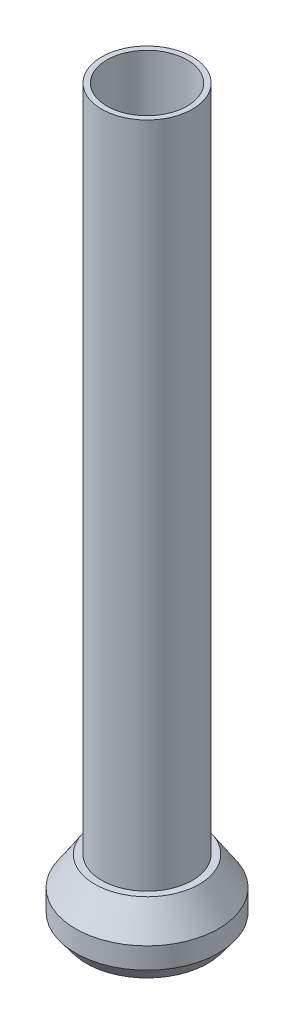
ISO-10303-21;
HEADER;
FILE_DESCRIPTION(('STEP AP214'),'2;1');
FILE_NAME('part.step','',(''),(''),'','','');
FILE_SCHEMA(('AUTOMOTIVE_DESIGN { 1 0 10303 214 1 1 1 1 }'));
ENDSEC;
DATA;
#1=APPLICATION_CONTEXT('core data for automotive mechanical design processes');
#2=APPLICATION_PROTOCOL_DEFINITION('international standard','automotive_design',2000,#1);
#3=PRODUCT_CONTEXT('',#1,'mechanical');
#4=PRODUCT('Part','Part','',(#3));
#5=PRODUCT_RELATED_PRODUCT_CATEGORY('part','',(#4));
#6=PRODUCT_DEFINITION_FORMATION('','',#4);
#7=PRODUCT_DEFINITION_CONTEXT('part definition',#1,'design');
#8=PRODUCT_DEFINITION('design','',#6,#7);
#9=PRODUCT_DEFINITION_SHAPE('','',#8);
#10=(LENGTH_UNIT() NAMED_UNIT(*) SI_UNIT(.MILLI.,.METRE.));
#11=(NAMED_UNIT(*) PLANE_ANGLE_UNIT() SI_UNIT($,.RADIAN.));
#12=(NAMED_UNIT(*) SI_UNIT($,.STERADIAN.) SOLID_ANGLE_UNIT());
#13=UNCERTAINTY_MEASURE_WITH_UNIT(LENGTH_MEASURE(1.E-05),#10,'distance_accuracy_value','');
#14=(GEOMETRIC_REPRESENTATION_CONTEXT(3) GLOBAL_UNCERTAINTY_ASSIGNED_CONTEXT((#13)) GLOBAL_UNIT_ASSIGNED_CONTEXT((#10,
#11,#12)) REPRESENTATION_CONTEXT('',''));
#15=CARTESIAN_POINT('',(0.,0.,0.));
#16=DIRECTION('',(0.,0.,1.));
#17=DIRECTION('',(1.,0.,0.));
#18=AXIS2_PLACEMENT_3D('',#15,#16,#17);
#19=CARTESIAN_POINT('',(0.,205.,0.));
#20=DIRECTION('',(0.,1.,0.));
#21=DIRECTION('',(0.,0.,1.));
#22=AXIS2_PLACEMENT_3D('',#19,#20,#21);
#23=PLANE('',#22);
#24=CARTESIAN_POINT('',(0.,205.,0.));
#25=DIRECTION('',(0.,1.,0.));
#26=DIRECTION('',(0.,0.,1.));
#27=AXIS2_PLACEMENT_3D('',#24,#25,#26);
#28=CIRCLE('',#27,12.7);
#29=CARTESIAN_POINT('',(0.,205.,-12.7));
#30=VERTEX_POINT('',#29);
#31=EDGE_CURVE('E44',#30,#30,#28,.T.);
#32=ORIENTED_EDGE('',*,*,#31,.T.);
#33=EDGE_LOOP('',(#32));
#34=FACE_BOUND('',#33,.T.);
#35=CARTESIAN_POINT('',(0.,205.,0.));
#36=DIRECTION('',(0.,1.,0.));
#37=DIRECTION('',(0.,0.,1.));
#38=AXIS2_PLACEMENT_3D('',#35,#36,#37);
#39=CIRCLE('',#38,11.227);
#40=CARTESIAN_POINT('',(0.,205.,-11.227));
#41=VERTEX_POINT('',#40);
#42=EDGE_CURVE('E48',#41,#41,#39,.T.);
#43=ORIENTED_EDGE('',*,*,#42,.F.);
#44=EDGE_LOOP('',(#43));
#45=FACE_BOUND('',#44,.T.);
#46=ADVANCED_FACE('F37',(#34,#45),#23,.T.);
#47=CARTESIAN_POINT('',(0.,205.,0.));
#48=DIRECTION('',(0.,-1.,0.));
#49=DIRECTION('',(0.,0.,-1.));
#50=AXIS2_PLACEMENT_3D('',#47,#48,#49);
#51=CYLINDRICAL_SURFACE('',#50,12.7);
#52=CARTESIAN_POINT('',(0.,18.,0.));
#53=DIRECTION('',(0.,1.,0.));
#54=DIRECTION('',(0.,0.,1.));
#55=AXIS2_PLACEMENT_3D('',#52,#53,#54);
#56=CIRCLE('',#55,12.7);
#57=CARTESIAN_POINT('',(0.,18.,-12.7));
#58=VERTEX_POINT('',#57);
#59=EDGE_CURVE('E52',#58,#58,#56,.T.);
#60=CARTESIAN_POINT('',(0.,18.,-12.7));
#61=CARTESIAN_POINT('',(0.,19.9479166666666,-12.7));
#62=CARTESIAN_POINT('',(0.,21.8958333333333,-12.7));
#63=CARTESIAN_POINT('',(0.,25.7916666666666,-12.7));
#64=CARTESIAN_POINT('',(0.,27.7395833333333,-12.7));
#65=CARTESIAN_POINT('',(0.,31.6354166666666,-12.7));
#66=CARTESIAN_POINT('',(0.,33.5833333333333,-12.7));
#67=CARTESIAN_POINT('',(0.,37.4791666666666,-12.7));
#68=CARTESIAN_POINT('',(0.,39.4270833333333,-12.7));
#69=CARTESIAN_POINT('',(0.,43.3229166666666,-12.7));
#70=CARTESIAN_POINT('',(0.,45.2708333333333,-12.7));
#71=CARTESIAN_POINT('',(0.,49.1666666666666,-12.7));
#72=CARTESIAN_POINT('',(0.,51.1145833333333,-12.7));
#73=CARTESIAN_POINT('',(0.,55.0104166666666,-12.7));
#74=CARTESIAN_POINT('',(0.,56.9583333333333,-12.7));
#75=CARTESIAN_POINT('',(0.,60.8541666666666,-12.7));
#76=CARTESIAN_POINT('',(0.,62.8020833333333,-12.7));
#77=CARTESIAN_POINT('',(0.,66.6979166666666,-12.7));
#78=CARTESIAN_POINT('',(0.,68.6458333333333,-12.7));
#79=CARTESIAN_POINT('',(0.,72.5416666666666,-12.7));
#80=CARTESIAN_POINT('',(0.,74.4895833333333,-12.7));
#81=CARTESIAN_POINT('',(0.,78.3854166666666,-12.7));
#82=CARTESIAN_POINT('',(0.,80.3333333333333,-12.7));
#83=CARTESIAN_POINT('',(0.,84.2291666666666,-12.7));
#84=CARTESIAN_POINT('',(0.,86.1770833333333,-12.7));
#85=CARTESIAN_POINT('',(0.,90.0729166666666,-12.7));
#86=CARTESIAN_POINT('',(0.,92.0208333333333,-12.7));
#87=CARTESIAN_POINT('',(0.,95.9166666666666,-12.7));
#88=CARTESIAN_POINT('',(0.,97.8645833333333,-12.7));
#89=CARTESIAN_POINT('',(0.,101.760416666667,-12.7));
#90=CARTESIAN_POINT('',(0.,103.708333333333,-12.7));
#91=CARTESIAN_POINT('',(0.,107.604166666667,-12.7));
#92=CARTESIAN_POINT('',(0.,109.552083333333,-12.7));
#93=CARTESIAN_POINT('',(0.,113.447916666667,-12.7));
#94=CARTESIAN_POINT('',(0.,115.395833333333,-12.7));
#95=CARTESIAN_POINT('',(0.,119.291666666667,-12.7));
#96=CARTESIAN_POINT('',(0.,121.239583333333,-12.7));
#97=CARTESIAN_POINT('',(0.,125.135416666667,-12.7));
#98=CARTESIAN_POINT('',(0.,127.083333333333,-12.7));
#99=CARTESIAN_POINT('',(0.,130.979166666667,-12.7));
#100=CARTESIAN_POINT('',(0.,132.927083333333,-12.7));
#101=CARTESIAN_POINT('',(0.,136.822916666667,-12.7));
#102=CARTESIAN_POINT('',(0.,138.770833333333,-12.7));
#103=CARTESIAN_POINT('',(0.,142.666666666667,-12.7));
#104=CARTESIAN_POINT('',(0.,144.614583333333,-12.7));
#105=CARTESIAN_POINT('',(0.,148.510416666667,-12.7));
#106=CARTESIAN_POINT('',(0.,150.458333333333,-12.7));
#107=CARTESIAN_POINT('',(0.,154.354166666667,-12.7));
#108=CARTESIAN_POINT('',(0.,156.302083333333,-12.7));
#109=CARTESIAN_POINT('',(0.,160.197916666667,-12.7));
#110=CARTESIAN_POINT('',(0.,162.145833333333,-12.7));
#111=CARTESIAN_POINT('',(0.,166.041666666667,-12.7));
#112=CARTESIAN_POINT('',(0.,167.989583333333,-12.7));
#113=CARTESIAN_POINT('',(0.,171.885416666667,-12.7));
#114=CARTESIAN_POINT('',(0.,173.833333333333,-12.7));
#115=CARTESIAN_POINT('',(0.,177.729166666667,-12.7));
#116=CARTESIAN_POINT('',(0.,179.677083333333,-12.7));
#117=CARTESIAN_POINT('',(0.,183.572916666667,-12.7));
#118=CARTESIAN_POINT('',(0.,185.520833333333,-12.7));
#119=CARTESIAN_POINT('',(0.,189.416666666667,-12.7));
#120=CARTESIAN_POINT('',(0.,191.364583333333,-12.7));
#121=CARTESIAN_POINT('',(0.,195.260416666667,-12.7));
#122=CARTESIAN_POINT('',(0.,197.208333333333,-12.7));
#123=CARTESIAN_POINT('',(0.,201.104166666667,-12.7));
#124=CARTESIAN_POINT('',(0.,203.052083333333,-12.7));
#125=CARTESIAN_POINT('',(0.,205.,-12.7));
#126=B_SPLINE_CURVE_WITH_KNOTS('',3,(#60,#61,#62,#63,#64,#65,#66,#67,#68,#69,#70,#71,#72,#73,
#74,#75,#76,#77,#78,#79,#80,#81,#82,#83,#84,#85,#86,#87,#88,#89,#90,#91,#92,#93,#94,#95,#96,#97,
#98,#99,#100,#101,#102,#103,#104,#105,#106,#107,#108,#109,#110,#111,#112,#113,#114,#115,#116,
#117,#118,#119,#120,#121,#122,#123,#124,#125),.UNSPECIFIED.,.F.,.F.,(4,2,2,2,2,2,2,2,2,2,2,2,2,
2,2,2,2,2,2,2,2,2,2,2,2,2,2,2,2,2,2,2,4),(0.,5.84375000000001,11.6875,17.53125,23.375,29.21875,
35.0625,40.90625,46.75,52.59375,58.4375,64.28125,70.125,75.96875,81.8125,87.65625,93.5,99.34375,
105.1875,111.03125,116.875,122.71875,128.5625,134.40625,140.25,146.09375,151.9375,157.78125,
163.625,169.46875,175.3125,181.15625,187.),.UNSPECIFIED.);
#127=EDGE_CURVE('BSEAM39',#58,#30,#126,.T.);
#128=ORIENTED_EDGE('',*,*,#59,.T.);
#129=ORIENTED_EDGE('',*,*,#31,.F.);
#130=ORIENTED_EDGE('',*,*,#127,.T.);
#131=ORIENTED_EDGE('',*,*,#127,.F.);
#132=EDGE_LOOP('',(#128,#130,#129,#131));
#133=FACE_BOUND('',#132,.T.);
#134=ADVANCED_FACE('F39',(#133),#51,.T.);
#135=CARTESIAN_POINT('',(0.,205.,0.));
#136=DIRECTION('',(0.,-1.,0.));
#137=DIRECTION('',(0.,0.,-1.));
#138=AXIS2_PLACEMENT_3D('',#135,#136,#137);
#139=CYLINDRICAL_SURFACE('',#138,11.227);
#140=CARTESIAN_POINT('',(0.,18.,0.));
#141=DIRECTION('',(0.,1.,0.));
#142=DIRECTION('',(0.,0.,1.));
#143=AXIS2_PLACEMENT_3D('',#140,#141,#142);
#144=CIRCLE('',#143,11.227);
#145=CARTESIAN_POINT('',(0.,18.,-11.227));
#146=VERTEX_POINT('',#145);
#147=EDGE_CURVE('E10',#146,#146,#144,.T.);
#148=CARTESIAN_POINT('',(0.,18.,-11.227));
#149=CARTESIAN_POINT('',(0.,19.9479166666666,-11.227));
#150=CARTESIAN_POINT('',(0.,21.8958333333333,-11.227));
#151=CARTESIAN_POINT('',(0.,25.7916666666666,-11.227));
#152=CARTESIAN_POINT('',(0.,27.7395833333333,-11.227));
#153=CARTESIAN_POINT('',(0.,31.6354166666666,-11.227));
#154=CARTESIAN_POINT('',(0.,33.5833333333333,-11.227));
#155=CARTESIAN_POINT('',(0.,37.4791666666666,-11.227));
#156=CARTESIAN_POINT('',(0.,39.4270833333333,-11.227));
#157=CARTESIAN_POINT('',(0.,43.3229166666666,-11.227));
#158=CARTESIAN_POINT('',(0.,45.2708333333333,-11.227));
#159=CARTESIAN_POINT('',(0.,49.1666666666666,-11.227));
#160=CARTESIAN_POINT('',(0.,51.1145833333333,-11.227));
#161=CARTESIAN_POINT('',(0.,55.0104166666666,-11.227));
#162=CARTESIAN_POINT('',(0.,56.9583333333333,-11.227));
#163=CARTESIAN_POINT('',(0.,60.8541666666666,-11.227));
#164=CARTESIAN_POINT('',(0.,62.8020833333333,-11.227));
#165=CARTESIAN_POINT('',(0.,66.6979166666666,-11.227));
#166=CARTESIAN_POINT('',(0.,68.6458333333333,-11.227));
#167=CARTESIAN_POINT('',(0.,72.5416666666667,-11.227));
#168=CARTESIAN_POINT('',(0.,74.4895833333333,-11.227));
#169=CARTESIAN_POINT('',(0.,78.3854166666667,-11.227));
#170=CARTESIAN_POINT('',(0.,80.3333333333333,-11.227));
#171=CARTESIAN_POINT('',(0.,84.2291666666666,-11.227));
#172=CARTESIAN_POINT('',(0.,86.1770833333333,-11.227));
#173=CARTESIAN_POINT('',(0.,90.0729166666666,-11.227));
#174=CARTESIAN_POINT('',(0.,92.0208333333333,-11.227));
#175=CARTESIAN_POINT('',(0.,95.9166666666666,-11.227));
#176=CARTESIAN_POINT('',(0.,97.8645833333333,-11.227));
#177=CARTESIAN_POINT('',(0.,101.760416666667,-11.227));
#178=CARTESIAN_POINT('',(0.,103.708333333333,-11.227));
#179=CARTESIAN_POINT('',(0.,107.604166666667,-11.227));
#180=CARTESIAN_POINT('',(0.,109.552083333333,-11.227));
#181=CARTESIAN_POINT('',(0.,113.447916666667,-11.227));
#182=CARTESIAN_POINT('',(0.,115.395833333333,-11.227));
#183=CARTESIAN_POINT('',(0.,119.291666666667,-11.227));
#184=CARTESIAN_POINT('',(0.,121.239583333333,-11.227));
#185=CARTESIAN_POINT('',(0.,125.135416666667,-11.227));
#186=CARTESIAN_POINT('',(0.,127.083333333333,-11.227));
#187=CARTESIAN_POINT('',(0.,130.979166666667,-11.227));
#188=CARTESIAN_POINT('',(0.,132.927083333333,-11.227));
#189=CARTESIAN_POINT('',(0.,136.822916666667,-11.227));
#190=CARTESIAN_POINT('',(0.,138.770833333333,-11.227));
#191=CARTESIAN_POINT('',(0.,142.666666666667,-11.227));
#192=CARTESIAN_POINT('',(0.,144.614583333333,-11.227));
#193=CARTESIAN_POINT('',(0.,148.510416666667,-11.227));
#194=CARTESIAN_POINT('',(0.,150.458333333333,-11.227));
#195=CARTESIAN_POINT('',(0.,154.354166666667,-11.227));
#196=CARTESIAN_POINT('',(0.,156.302083333333,-11.227));
#197=CARTESIAN_POINT('',(0.,160.197916666667,-11.227));
#198=CARTESIAN_POINT('',(0.,162.145833333333,-11.227));
#199=CARTESIAN_POINT('',(0.,166.041666666667,-11.227));
#200=CARTESIAN_POINT('',(0.,167.989583333333,-11.227));
#201=CARTESIAN_POINT('',(0.,171.885416666667,-11.227));
#202=CARTESIAN_POINT('',(0.,173.833333333333,-11.227));
#203=CARTESIAN_POINT('',(0.,177.729166666667,-11.227));
#204=CARTESIAN_POINT('',(0.,179.677083333333,-11.227));
#205=CARTESIAN_POINT('',(0.,183.572916666667,-11.227));
#206=CARTESIAN_POINT('',(0.,185.520833333333,-11.227));
#207=CARTESIAN_POINT('',(0.,189.416666666667,-11.227));
#208=CARTESIAN_POINT('',(0.,191.364583333333,-11.227));
#209=CARTESIAN_POINT('',(0.,195.260416666667,-11.227));
#210=CARTESIAN_POINT('',(0.,197.208333333333,-11.227));
#211=CARTESIAN_POINT('',(0.,201.104166666667,-11.227));
#212=CARTESIAN_POINT('',(0.,203.052083333333,-11.227));
#213=CARTESIAN_POINT('',(0.,205.,-11.227));
#214=B_SPLINE_CURVE_WITH_KNOTS('',3,(#148,#149,#150,#151,#152,#153,#154,#155,#156,#157,#158,
#159,#160,#161,#162,#163,#164,#165,#166,#167,#168,#169,#170,#171,#172,#173,#174,#175,#176,#177,
#178,#179,#180,#181,#182,#183,#184,#185,#186,#187,#188,#189,#190,#191,#192,#193,#194,#195,#196,
#197,#198,#199,#200,#201,#202,#203,#204,#205,#206,#207,#208,#209,#210,#211,#212,#213),
.UNSPECIFIED.,.F.,.F.,(4,2,2,2,2,2,2,2,2,2,2,2,2,2,2,2,2,2,2,2,2,2,2,2,2,2,2,2,2,2,2,2,4),(0.,
5.84375000000001,11.6875,17.53125,23.375,29.21875,35.0625,40.90625,46.75,52.59375,58.4375,
64.28125,70.125,75.96875,81.8125,87.65625,93.5,99.34375,105.1875,111.03125,116.875,122.71875,
128.5625,134.40625,140.25,146.09375,151.9375,157.78125,163.625,169.46875,175.3125,181.15625,
187.),.UNSPECIFIED.);
#215=EDGE_CURVE('BSEAM89',#146,#41,#214,.T.);
#216=ORIENTED_EDGE('',*,*,#147,.F.);
#217=ORIENTED_EDGE('',*,*,#42,.T.);
#218=ORIENTED_EDGE('',*,*,#215,.T.);
#219=ORIENTED_EDGE('',*,*,#215,.F.);
#220=EDGE_LOOP('',(#216,#218,#217,#219));
#221=FACE_BOUND('',#220,.T.);
#222=ADVANCED_FACE('F89',(#221),#139,.F.);
#223=CARTESIAN_POINT('',(14.605,18.,0.));
#224=DIRECTION('',(0.,1.,0.));
#225=DIRECTION('',(0.,0.,1.));
#226=AXIS2_PLACEMENT_3D('',#223,#224,#225);
#227=PLANE('',#226);
#228=ORIENTED_EDGE('',*,*,#147,.T.);
#229=EDGE_LOOP('',(#228));
#230=FACE_BOUND('',#229,.T.);
#231=ADVANCED_FACE('F78',(#230),#227,.T.);
#232=CARTESIAN_POINT('',(0.,0.,0.));
#233=DIRECTION('',(0.,1.,0.));
#234=DIRECTION('',(0.,0.,1.));
#235=AXIS2_PLACEMENT_3D('',#232,#233,#234);
#236=CONICAL_SURFACE('',#235,17.,0.643501108793284);
#237=CARTESIAN_POINT('',(0.,4.,0.));
#238=DIRECTION('',(0.,-1.,0.));
#239=DIRECTION('',(0.,0.,-1.));
#240=AXIS2_PLACEMENT_3D('',#237,#238,#239);
#241=CIRCLE('',#240,20.);
#242=CARTESIAN_POINT('',(0.,4.,-20.));
#243=VERTEX_POINT('',#242);
#244=EDGE_CURVE('E60',#243,#243,#241,.T.);
#245=ORIENTED_EDGE('',*,*,#244,.T.);
#246=EDGE_LOOP('',(#245));
#247=FACE_BOUND('',#246,.T.);
#248=CARTESIAN_POINT('',(0.,0.,0.));
#249=DIRECTION('',(0.,-1.,0.));
#250=DIRECTION('',(0.,0.,-1.));
#251=AXIS2_PLACEMENT_3D('',#248,#249,#250);
#252=CIRCLE('',#251,17.);
#253=CARTESIAN_POINT('',(0.,0.,-17.));
#254=VERTEX_POINT('',#253);
#255=EDGE_CURVE('E57',#254,#254,#252,.T.);
#256=ORIENTED_EDGE('',*,*,#255,.F.);
#257=EDGE_LOOP('',(#256));
#258=FACE_BOUND('',#257,.T.);
#259=ADVANCED_FACE('F88',(#247,#258),#236,.T.);
#260=CARTESIAN_POINT('',(0.,-10.,0.));
#261=DIRECTION('',(0.,-1.,0.));
#262=DIRECTION('',(0.,0.,-1.));
#263=AXIS2_PLACEMENT_3D('',#260,#261,#262);
#264=CYLINDRICAL_SURFACE('',#263,20.);
#265=CARTESIAN_POINT('',(0.,9.9,0.));
#266=DIRECTION('',(0.,-1.,0.));
#267=DIRECTION('',(0.,0.,-1.));
#268=AXIS2_PLACEMENT_3D('',#265,#266,#267);
#269=CIRCLE('',#268,20.);
#270=CARTESIAN_POINT('',(0.,9.9,-20.));
#271=VERTEX_POINT('',#270);
#272=EDGE_CURVE('E63',#271,#271,#269,.T.);
#273=ORIENTED_EDGE('',*,*,#272,.T.);
#274=EDGE_LOOP('',(#273));
#275=FACE_BOUND('',#274,.T.);
#276=ORIENTED_EDGE('',*,*,#244,.F.);
#277=EDGE_LOOP('',(#276));
#278=FACE_BOUND('',#277,.T.);
#279=ADVANCED_FACE('F84',(#275,#278),#264,.T.);
#280=CARTESIAN_POINT('',(0.,9.9,0.));
#281=DIRECTION('',(0.,-1.,0.));
#282=DIRECTION('',(0.,0.,-1.));
#283=AXIS2_PLACEMENT_3D('',#280,#281,#282);
#284=CONICAL_SURFACE('',#283,20.,0.5875751313593);
#285=CARTESIAN_POINT('',(0.,18.,0.));
#286=DIRECTION('',(0.,-1.,0.));
#287=DIRECTION('',(0.,0.,-1.));
#288=AXIS2_PLACEMENT_3D('',#285,#286,#287);
#289=CIRCLE('',#288,14.605);
#290=CARTESIAN_POINT('',(0.,18.,-14.605));
#291=VERTEX_POINT('',#290);
#292=EDGE_CURVE('E66',#291,#291,#289,.T.);
#293=ORIENTED_EDGE('',*,*,#292,.T.);
#294=EDGE_LOOP('',(#293));
#295=FACE_BOUND('',#294,.T.);
#296=ORIENTED_EDGE('',*,*,#272,.F.);
#297=EDGE_LOOP('',(#296));
#298=FACE_BOUND('',#297,.T.);
#299=ADVANCED_FACE('F70',(#295,#298),#284,.T.);
#300=ORIENTED_EDGE('',*,*,#59,.F.);
#301=EDGE_LOOP('',(#300));
#302=FACE_BOUND('',#301,.T.);
#303=ORIENTED_EDGE('',*,*,#292,.F.);
#304=EDGE_LOOP('',(#303));
#305=FACE_BOUND('',#304,.T.);
#306=ADVANCED_FACE('F73',(#302,#305),#227,.T.);
#307=CARTESIAN_POINT('',(0.,0.,0.));
#308=DIRECTION('',(0.,1.,0.));
#309=DIRECTION('',(0.,0.,1.));
#310=AXIS2_PLACEMENT_3D('',#307,#308,#309);
#311=PLANE('',#310);
#312=ORIENTED_EDGE('',*,*,#255,.T.);
#313=EDGE_LOOP('',(#312));
#314=FACE_BOUND('',#313,.T.);
#315=ADVANCED_FACE('F75',(#314),#311,.F.);
#316=CLOSED_SHELL('',(#46,#134,#222,#231,#259,#279,#299,#306,#315));
#317=MANIFOLD_SOLID_BREP('B2',#316);
#318=ADVANCED_BREP_SHAPE_REPRESENTATION('',(#18,#317),#14);
#319=SHAPE_DEFINITION_REPRESENTATION(#9,#318);
ENDSEC;
END-ISO-10303-21;
